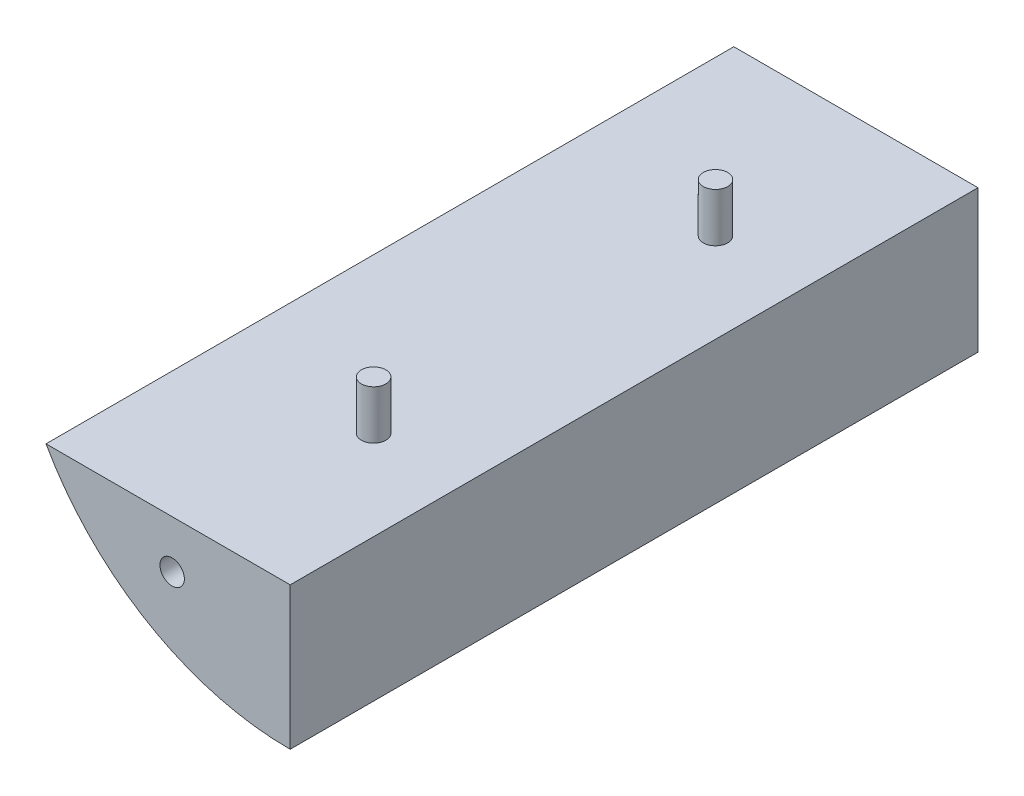
ISO-10303-21;
HEADER;
FILE_DESCRIPTION(('STEP AP214'),'2;1');
FILE_NAME('part.step','',(''),(''),'','','');
FILE_SCHEMA(('AUTOMOTIVE_DESIGN { 1 0 10303 214 1 1 1 1 }'));
ENDSEC;
DATA;
#1=APPLICATION_CONTEXT('core data for automotive mechanical design processes');
#2=APPLICATION_PROTOCOL_DEFINITION('international standard','automotive_design',2000,#1);
#3=PRODUCT_CONTEXT('',#1,'mechanical');
#4=PRODUCT('Part','Part','',(#3));
#5=PRODUCT_RELATED_PRODUCT_CATEGORY('part','',(#4));
#6=PRODUCT_DEFINITION_FORMATION('','',#4);
#7=PRODUCT_DEFINITION_CONTEXT('part definition',#1,'design');
#8=PRODUCT_DEFINITION('design','',#6,#7);
#9=PRODUCT_DEFINITION_SHAPE('','',#8);
#10=(LENGTH_UNIT() NAMED_UNIT(*) SI_UNIT(.MILLI.,.METRE.));
#11=(NAMED_UNIT(*) PLANE_ANGLE_UNIT() SI_UNIT($,.RADIAN.));
#12=(NAMED_UNIT(*) SI_UNIT($,.STERADIAN.) SOLID_ANGLE_UNIT());
#13=UNCERTAINTY_MEASURE_WITH_UNIT(LENGTH_MEASURE(1.E-05),#10,'distance_accuracy_value','');
#14=(GEOMETRIC_REPRESENTATION_CONTEXT(3) GLOBAL_UNCERTAINTY_ASSIGNED_CONTEXT((#13)) GLOBAL_UNIT_ASSIGNED_CONTEXT((#10,
#11,#12)) REPRESENTATION_CONTEXT('',''));
#15=CARTESIAN_POINT('',(0.,0.,0.));
#16=DIRECTION('',(0.,0.,1.));
#17=DIRECTION('',(1.,0.,0.));
#18=AXIS2_PLACEMENT_3D('',#15,#16,#17);
#19=CARTESIAN_POINT('',(59.7934655343153,33.5745123445405,169.));
#20=DIRECTION('',(0.,0.,-1.));
#21=DIRECTION('',(-1.,0.,0.));
#22=AXIS2_PLACEMENT_3D('',#19,#20,#21);
#23=CYLINDRICAL_SURFACE('',#22,68.5748233667215);
#24=CARTESIAN_POINT('',(59.7934655343153,33.5745123445405,0.));
#25=DIRECTION('',(0.,0.,1.));
#26=DIRECTION('',(1.,0.,0.));
#27=AXIS2_PLACEMENT_3D('',#24,#25,#26);
#28=CIRCLE('',#27,68.5748233667215);
#29=CARTESIAN_POINT('',(0.,0.,0.));
#30=VERTEX_POINT('',#29);
#31=CARTESIAN_POINT('',(60.,-35.,0.));
#32=VERTEX_POINT('',#31);
#33=EDGE_CURVE('E83',#30,#32,#28,.T.);
#34=ORIENTED_EDGE('',*,*,#33,.T.);
#35=DIRECTION('',(0.,0.,-1.));
#36=VECTOR('',#35,1.);
#37=CARTESIAN_POINT('',(60.,-35.,169.));
#38=LINE('',#37,#36);
#39=CARTESIAN_POINT('',(60.,-35.,169.));
#40=VERTEX_POINT('',#39);
#41=EDGE_CURVE('E73',#40,#32,#38,.T.);
#42=ORIENTED_EDGE('',*,*,#41,.F.);
#43=CARTESIAN_POINT('',(59.7934655343153,33.5745123445405,169.));
#44=DIRECTION('',(0.,0.,1.));
#45=DIRECTION('',(1.,0.,0.));
#46=AXIS2_PLACEMENT_3D('',#43,#44,#45);
#47=CIRCLE('',#46,68.5748233667215);
#48=CARTESIAN_POINT('',(0.,0.,169.));
#49=VERTEX_POINT('',#48);
#50=EDGE_CURVE('E76',#49,#40,#47,.T.);
#51=ORIENTED_EDGE('',*,*,#50,.F.);
#52=DIRECTION('',(0.,0.,-1.));
#53=VECTOR('',#52,1.);
#54=CARTESIAN_POINT('',(0.,0.,169.));
#55=LINE('',#54,#53);
#56=EDGE_CURVE('E86',#49,#30,#55,.T.);
#57=ORIENTED_EDGE('',*,*,#56,.T.);
#58=EDGE_LOOP('',(#34,#42,#51,#57));
#59=FACE_BOUND('',#58,.T.);
#60=ADVANCED_FACE('F33',(#59),#23,.T.);
#61=CARTESIAN_POINT('',(60.,0.,169.));
#62=DIRECTION('',(-1.,0.,0.));
#63=DIRECTION('',(0.,0.,1.));
#64=AXIS2_PLACEMENT_3D('',#61,#62,#63);
#65=PLANE('',#64);
#66=DIRECTION('',(0.,1.,0.));
#67=VECTOR('',#66,1.);
#68=CARTESIAN_POINT('',(60.,0.,0.));
#69=LINE('',#68,#67);
#70=CARTESIAN_POINT('',(60.,0.,0.));
#71=VERTEX_POINT('',#70);
#72=EDGE_CURVE('E62',#32,#71,#69,.T.);
#73=ORIENTED_EDGE('',*,*,#72,.T.);
#74=DIRECTION('',(0.,0.,-1.));
#75=VECTOR('',#74,1.);
#76=CARTESIAN_POINT('',(60.,0.,169.));
#77=LINE('',#76,#75);
#78=CARTESIAN_POINT('',(60.,0.,169.));
#79=VERTEX_POINT('',#78);
#80=EDGE_CURVE('E75',#79,#71,#77,.T.);
#81=ORIENTED_EDGE('',*,*,#80,.F.);
#82=DIRECTION('',(0.,1.,0.));
#83=VECTOR('',#82,1.);
#84=CARTESIAN_POINT('',(60.,0.,169.));
#85=LINE('',#84,#83);
#86=EDGE_CURVE('E70',#40,#79,#85,.T.);
#87=ORIENTED_EDGE('',*,*,#86,.F.);
#88=ORIENTED_EDGE('',*,*,#41,.T.);
#89=EDGE_LOOP('',(#73,#81,#87,#88));
#90=FACE_BOUND('',#89,.T.);
#91=ADVANCED_FACE('F71',(#90),#65,.F.);
#92=CARTESIAN_POINT('',(0.,0.,169.));
#93=DIRECTION('',(0.,-1.,0.));
#94=DIRECTION('',(0.,0.,-1.));
#95=AXIS2_PLACEMENT_3D('',#92,#93,#94);
#96=PLANE('',#95);
#97=CARTESIAN_POINT('',(38.,0.,126.5));
#98=DIRECTION('',(0.,-1.,0.));
#99=DIRECTION('',(0.,0.,-1.));
#100=AXIS2_PLACEMENT_3D('',#97,#98,#99);
#101=CIRCLE('',#100,3.);
#102=CARTESIAN_POINT('',(38.,0.,123.5));
#103=VERTEX_POINT('',#102);
#104=EDGE_CURVE('E11',#103,#103,#101,.F.);
#105=ORIENTED_EDGE('',*,*,#104,.F.);
#106=EDGE_LOOP('',(#105));
#107=FACE_BOUND('',#106,.T.);
#108=CARTESIAN_POINT('',(38.,0.,42.5));
#109=DIRECTION('',(0.,-1.,0.));
#110=DIRECTION('',(0.,0.,-1.));
#111=AXIS2_PLACEMENT_3D('',#108,#109,#110);
#112=CIRCLE('',#111,3.);
#113=CARTESIAN_POINT('',(38.,0.,39.5));
#114=VERTEX_POINT('',#113);
#115=EDGE_CURVE('E41',#114,#114,#112,.F.);
#116=ORIENTED_EDGE('',*,*,#115,.F.);
#117=EDGE_LOOP('',(#116));
#118=FACE_BOUND('',#117,.T.);
#119=DIRECTION('',(-1.,0.,0.));
#120=VECTOR('',#119,1.);
#121=CARTESIAN_POINT('',(0.,0.,0.));
#122=LINE('',#121,#120);
#123=EDGE_CURVE('E67',#71,#30,#122,.T.);
#124=ORIENTED_EDGE('',*,*,#123,.T.);
#125=ORIENTED_EDGE('',*,*,#56,.F.);
#126=DIRECTION('',(-1.,0.,0.));
#127=VECTOR('',#126,1.);
#128=CARTESIAN_POINT('',(0.,0.,169.));
#129=LINE('',#128,#127);
#130=EDGE_CURVE('E49',#79,#49,#129,.T.);
#131=ORIENTED_EDGE('',*,*,#130,.F.);
#132=ORIENTED_EDGE('',*,*,#80,.T.);
#133=EDGE_LOOP('',(#124,#125,#131,#132));
#134=FACE_BOUND('',#133,.T.);
#135=ADVANCED_FACE('F124',(#107,#118,#134),#96,.F.);
#136=CARTESIAN_POINT('',(59.7934655343153,33.5745123445405,169.));
#137=DIRECTION('',(0.,0.,1.));
#138=DIRECTION('',(1.,0.,0.));
#139=AXIS2_PLACEMENT_3D('',#136,#137,#138);
#140=PLANE('',#139);
#141=CARTESIAN_POINT('',(31.,-11.7703103215282,169.));
#142=DIRECTION('',(0.,0.,1.));
#143=DIRECTION('',(1.,0.,0.));
#144=AXIS2_PLACEMENT_3D('',#141,#142,#143);
#145=CIRCLE('',#144,3.);
#146=CARTESIAN_POINT('',(34.,-11.7703103215282,169.));
#147=VERTEX_POINT('',#146);
#148=EDGE_CURVE('E107',#147,#147,#145,.T.);
#149=ORIENTED_EDGE('',*,*,#148,.F.);
#150=EDGE_LOOP('',(#149));
#151=FACE_BOUND('',#150,.T.);
#152=ORIENTED_EDGE('',*,*,#50,.T.);
#153=ORIENTED_EDGE('',*,*,#86,.T.);
#154=ORIENTED_EDGE('',*,*,#130,.T.);
#155=EDGE_LOOP('',(#152,#153,#154));
#156=FACE_BOUND('',#155,.T.);
#157=ADVANCED_FACE('F79',(#151,#156),#140,.T.);
#158=CARTESIAN_POINT('',(59.7934655343153,33.5745123445405,0.));
#159=DIRECTION('',(0.,0.,1.));
#160=DIRECTION('',(1.,0.,0.));
#161=AXIS2_PLACEMENT_3D('',#158,#159,#160);
#162=PLANE('',#161);
#163=CARTESIAN_POINT('',(31.,-12.,0.));
#164=DIRECTION('',(0.,0.,-1.));
#165=DIRECTION('',(-1.,0.,0.));
#166=AXIS2_PLACEMENT_3D('',#163,#164,#165);
#167=CIRCLE('',#166,3.30730066198267);
#168=CARTESIAN_POINT('',(27.6926993380173,-12.,0.));
#169=VERTEX_POINT('',#168);
#170=EDGE_CURVE('E95',#169,#169,#167,.T.);
#171=ORIENTED_EDGE('',*,*,#170,.F.);
#172=EDGE_LOOP('',(#171));
#173=FACE_BOUND('',#172,.T.);
#174=ORIENTED_EDGE('',*,*,#33,.F.);
#175=ORIENTED_EDGE('',*,*,#123,.F.);
#176=ORIENTED_EDGE('',*,*,#72,.F.);
#177=EDGE_LOOP('',(#174,#175,#176));
#178=FACE_BOUND('',#177,.T.);
#179=ADVANCED_FACE('F123',(#173,#178),#162,.F.);
#180=CARTESIAN_POINT('',(31.,-12.,22.));
#181=DIRECTION('',(0.,0.,-1.));
#182=DIRECTION('',(-1.,0.,0.));
#183=AXIS2_PLACEMENT_3D('',#180,#181,#182);
#184=CYLINDRICAL_SURFACE('',#183,3.30730066198267);
#185=CARTESIAN_POINT('',(31.,-12.,22.));
#186=DIRECTION('',(0.,0.,-1.));
#187=DIRECTION('',(-1.,0.,0.));
#188=AXIS2_PLACEMENT_3D('',#185,#186,#187);
#189=CIRCLE('',#188,3.30730066198267);
#190=CARTESIAN_POINT('',(27.6926993380173,-12.,22.));
#191=VERTEX_POINT('',#190);
#192=EDGE_CURVE('E93',#191,#191,#189,.T.);
#193=ORIENTED_EDGE('',*,*,#192,.F.);
#194=EDGE_LOOP('',(#193));
#195=FACE_BOUND('',#194,.T.);
#196=ORIENTED_EDGE('',*,*,#170,.T.);
#197=EDGE_LOOP('',(#196));
#198=FACE_BOUND('',#197,.T.);
#199=ADVANCED_FACE('F131',(#195,#198),#184,.F.);
#200=CARTESIAN_POINT('',(31.,-12.,22.));
#201=DIRECTION('',(0.,0.,-1.));
#202=DIRECTION('',(-1.,0.,0.));
#203=AXIS2_PLACEMENT_3D('',#200,#201,#202);
#204=PLANE('',#203);
#205=ORIENTED_EDGE('',*,*,#192,.T.);
#206=EDGE_LOOP('',(#205));
#207=FACE_BOUND('',#206,.T.);
#208=ADVANCED_FACE('F169',(#207),#204,.T.);
#209=CARTESIAN_POINT('',(38.,12.,42.5));
#210=DIRECTION('',(0.,-1.,0.));
#211=DIRECTION('',(0.,0.,-1.));
#212=AXIS2_PLACEMENT_3D('',#209,#210,#211);
#213=CYLINDRICAL_SURFACE('',#212,3.);
#214=CARTESIAN_POINT('',(38.,12.,42.5));
#215=DIRECTION('',(0.,1.,0.));
#216=DIRECTION('',(0.,0.,1.));
#217=AXIS2_PLACEMENT_3D('',#214,#215,#216);
#218=CIRCLE('',#217,3.);
#219=CARTESIAN_POINT('',(38.,12.,45.5));
#220=VERTEX_POINT('',#219);
#221=EDGE_CURVE('E98',#220,#220,#218,.T.);
#222=ORIENTED_EDGE('',*,*,#221,.F.);
#223=EDGE_LOOP('',(#222));
#224=FACE_BOUND('',#223,.T.);
#225=ORIENTED_EDGE('',*,*,#115,.T.);
#226=EDGE_LOOP('',(#225));
#227=FACE_BOUND('',#226,.T.);
#228=ADVANCED_FACE('F175',(#224,#227),#213,.T.);
#229=CARTESIAN_POINT('',(38.,12.,42.5));
#230=DIRECTION('',(0.,1.,0.));
#231=DIRECTION('',(0.,0.,1.));
#232=AXIS2_PLACEMENT_3D('',#229,#230,#231);
#233=PLANE('',#232);
#234=ORIENTED_EDGE('',*,*,#221,.T.);
#235=EDGE_LOOP('',(#234));
#236=FACE_BOUND('',#235,.T.);
#237=ADVANCED_FACE('F183',(#236),#233,.T.);
#238=CARTESIAN_POINT('',(38.,12.,126.5));
#239=DIRECTION('',(0.,-1.,0.));
#240=DIRECTION('',(0.,0.,-1.));
#241=AXIS2_PLACEMENT_3D('',#238,#239,#240);
#242=CYLINDRICAL_SURFACE('',#241,3.);
#243=CARTESIAN_POINT('',(38.,12.,126.5));
#244=DIRECTION('',(0.,1.,0.));
#245=DIRECTION('',(0.,0.,1.));
#246=AXIS2_PLACEMENT_3D('',#243,#244,#245);
#247=CIRCLE('',#246,3.);
#248=CARTESIAN_POINT('',(38.,12.,129.5));
#249=VERTEX_POINT('',#248);
#250=EDGE_CURVE('E103',#249,#249,#247,.T.);
#251=ORIENTED_EDGE('',*,*,#250,.F.);
#252=EDGE_LOOP('',(#251));
#253=FACE_BOUND('',#252,.T.);
#254=ORIENTED_EDGE('',*,*,#104,.T.);
#255=EDGE_LOOP('',(#254));
#256=FACE_BOUND('',#255,.T.);
#257=ADVANCED_FACE('F190',(#253,#256),#242,.T.);
#258=CARTESIAN_POINT('',(38.,12.,126.5));
#259=DIRECTION('',(0.,1.,0.));
#260=DIRECTION('',(0.,0.,1.));
#261=AXIS2_PLACEMENT_3D('',#258,#259,#260);
#262=PLANE('',#261);
#263=ORIENTED_EDGE('',*,*,#250,.T.);
#264=EDGE_LOOP('',(#263));
#265=FACE_BOUND('',#264,.T.);
#266=ADVANCED_FACE('F118',(#265),#262,.T.);
#267=CARTESIAN_POINT('',(31.,-11.7703103215282,147.));
#268=DIRECTION('',(0.,0.,1.));
#269=DIRECTION('',(1.,0.,0.));
#270=AXIS2_PLACEMENT_3D('',#267,#268,#269);
#271=CYLINDRICAL_SURFACE('',#270,3.);
#272=CARTESIAN_POINT('',(31.,-11.7703103215282,147.));
#273=DIRECTION('',(0.,0.,1.));
#274=DIRECTION('',(1.,0.,0.));
#275=AXIS2_PLACEMENT_3D('',#272,#273,#274);
#276=CIRCLE('',#275,3.);
#277=CARTESIAN_POINT('',(34.,-11.7703103215282,147.));
#278=VERTEX_POINT('',#277);
#279=EDGE_CURVE('E106',#278,#278,#276,.T.);
#280=ORIENTED_EDGE('',*,*,#279,.F.);
#281=EDGE_LOOP('',(#280));
#282=FACE_BOUND('',#281,.T.);
#283=ORIENTED_EDGE('',*,*,#148,.T.);
#284=EDGE_LOOP('',(#283));
#285=FACE_BOUND('',#284,.T.);
#286=ADVANCED_FACE('F115',(#282,#285),#271,.F.);
#287=CARTESIAN_POINT('',(31.,-11.7703103215282,147.));
#288=DIRECTION('',(0.,0.,1.));
#289=DIRECTION('',(1.,0.,0.));
#290=AXIS2_PLACEMENT_3D('',#287,#288,#289);
#291=PLANE('',#290);
#292=ORIENTED_EDGE('',*,*,#279,.T.);
#293=EDGE_LOOP('',(#292));
#294=FACE_BOUND('',#293,.T.);
#295=ADVANCED_FACE('F113',(#294),#291,.T.);
#296=CLOSED_SHELL('',(#60,#91,#135,#157,#179,#199,#208,#228,#237,#257,#266,#286,#295));
#297=MANIFOLD_SOLID_BREP('B2',#296);
#298=ADVANCED_BREP_SHAPE_REPRESENTATION('',(#18,#297),#14);
#299=SHAPE_DEFINITION_REPRESENTATION(#9,#298);
ENDSEC;
END-ISO-10303-21;
